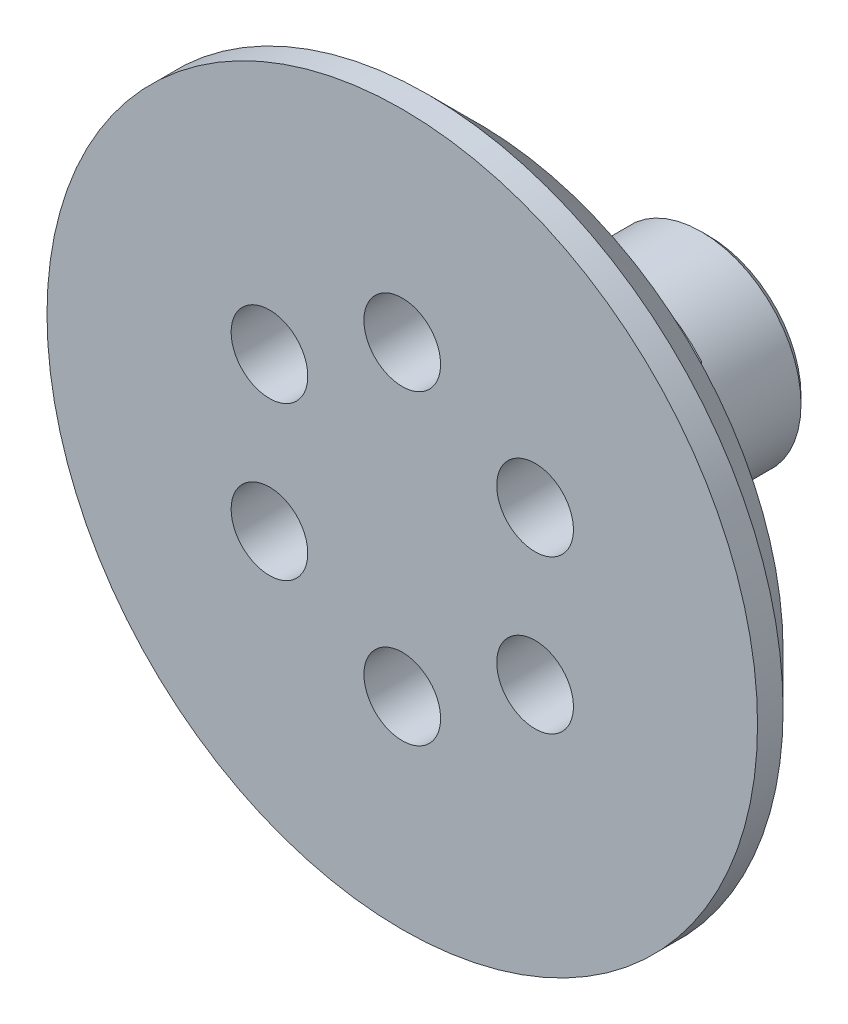
ISO-10303-21;
HEADER;
FILE_DESCRIPTION(('STEP AP214'),'2;1');
FILE_NAME('part.step','',(''),(''),'','','');
FILE_SCHEMA(('AUTOMOTIVE_DESIGN { 1 0 10303 214 1 1 1 1 }'));
ENDSEC;
DATA;
#1=APPLICATION_CONTEXT('core data for automotive mechanical design processes');
#2=APPLICATION_PROTOCOL_DEFINITION('international standard','automotive_design',2000,#1);
#3=PRODUCT_CONTEXT('',#1,'mechanical');
#4=PRODUCT('Part','Part','',(#3));
#5=PRODUCT_RELATED_PRODUCT_CATEGORY('part','',(#4));
#6=PRODUCT_DEFINITION_FORMATION('','',#4);
#7=PRODUCT_DEFINITION_CONTEXT('part definition',#1,'design');
#8=PRODUCT_DEFINITION('design','',#6,#7);
#9=PRODUCT_DEFINITION_SHAPE('','',#8);
#10=(LENGTH_UNIT() NAMED_UNIT(*) SI_UNIT(.MILLI.,.METRE.));
#11=(NAMED_UNIT(*) PLANE_ANGLE_UNIT() SI_UNIT($,.RADIAN.));
#12=(NAMED_UNIT(*) SI_UNIT($,.STERADIAN.) SOLID_ANGLE_UNIT());
#13=UNCERTAINTY_MEASURE_WITH_UNIT(LENGTH_MEASURE(1.E-05),#10,'distance_accuracy_value','');
#14=(GEOMETRIC_REPRESENTATION_CONTEXT(3) GLOBAL_UNCERTAINTY_ASSIGNED_CONTEXT((#13)) GLOBAL_UNIT_ASSIGNED_CONTEXT((#10,
#11,#12)) REPRESENTATION_CONTEXT('',''));
#15=CARTESIAN_POINT('',(0.,0.,0.));
#16=DIRECTION('',(0.,0.,1.));
#17=DIRECTION('',(1.,0.,0.));
#18=AXIS2_PLACEMENT_3D('',#15,#16,#17);
#19=CARTESIAN_POINT('',(0.,0.,4.));
#20=DIRECTION('',(0.,0.,1.));
#21=DIRECTION('',(1.,0.,0.));
#22=AXIS2_PLACEMENT_3D('',#19,#20,#21);
#23=CYLINDRICAL_SURFACE('',#22,4.9);
#24=CARTESIAN_POINT('',(0.,0.,9.));
#25=DIRECTION('',(0.,0.,1.));
#26=DIRECTION('',(1.,0.,0.));
#27=AXIS2_PLACEMENT_3D('',#24,#25,#26);
#28=CIRCLE('',#27,4.9);
#29=CARTESIAN_POINT('',(-4.62722329563246,-1.61208082066511,9.));
#30=VERTEX_POINT('',#29);
#31=CARTESIAN_POINT('',(-4.62722329563267,1.61208082066449,9.));
#32=VERTEX_POINT('',#31);
#33=EDGE_CURVE('E185',#30,#32,#28,.F.);
#34=ORIENTED_EDGE('',*,*,#33,.T.);
#35=DIRECTION('',(0.,0.,-1.));
#36=VECTOR('',#35,1.);
#37=CARTESIAN_POINT('',(-4.62722329563267,1.61208082066449,6.));
#38=LINE('',#37,#36);
#39=CARTESIAN_POINT('',(-4.62722329563267,1.61208082066449,4.));
#40=VERTEX_POINT('',#39);
#41=EDGE_CURVE('E355',#32,#40,#38,.T.);
#42=ORIENTED_EDGE('',*,*,#41,.T.);
#43=CARTESIAN_POINT('',(0.,0.,4.));
#44=DIRECTION('',(0.,0.,-1.));
#45=DIRECTION('',(-1.,0.,0.));
#46=AXIS2_PLACEMENT_3D('',#43,#44,#45);
#47=CIRCLE('',#46,4.9);
#48=CARTESIAN_POINT('',(-4.62722329563246,-1.61208082066511,4.));
#49=VERTEX_POINT('',#48);
#50=EDGE_CURVE('E360',#49,#40,#47,.T.);
#51=ORIENTED_EDGE('',*,*,#50,.F.);
#52=DIRECTION('',(0.,0.,-1.));
#53=VECTOR('',#52,1.);
#54=CARTESIAN_POINT('',(-4.62722329563246,-1.61208082066511,6.));
#55=LINE('',#54,#53);
#56=EDGE_CURVE('E344',#49,#30,#55,.F.);
#57=ORIENTED_EDGE('',*,*,#56,.T.);
#58=EDGE_LOOP('',(#34,#42,#51,#57));
#59=FACE_BOUND('',#58,.T.);
#60=ADVANCED_FACE('F39',(#59),#23,.T.);
#61=CARTESIAN_POINT('',(-0.917508704166362,-4.81333333333346,9.));
#62=VERTEX_POINT('',#61);
#63=CARTESIAN_POINT('',(-3.70971459146531,-3.20125251266897,9.));
#64=VERTEX_POINT('',#63);
#65=EDGE_CURVE('E616',#62,#64,#28,.F.);
#66=ORIENTED_EDGE('',*,*,#65,.T.);
#67=DIRECTION('',(0.,0.,-1.));
#68=VECTOR('',#67,1.);
#69=CARTESIAN_POINT('',(-3.70971459146531,-3.20125251266897,6.));
#70=LINE('',#69,#68);
#71=CARTESIAN_POINT('',(-3.70971459146531,-3.20125251266897,4.));
#72=VERTEX_POINT('',#71);
#73=EDGE_CURVE('E347',#64,#72,#70,.T.);
#74=ORIENTED_EDGE('',*,*,#73,.T.);
#75=CARTESIAN_POINT('',(-0.917508704166366,-4.81333333333346,4.));
#76=VERTEX_POINT('',#75);
#77=EDGE_CURVE('E363',#76,#72,#47,.T.);
#78=ORIENTED_EDGE('',*,*,#77,.F.);
#79=DIRECTION('',(0.,0.,-1.));
#80=VECTOR('',#79,1.);
#81=CARTESIAN_POINT('',(-0.917508704166363,-4.81333333333346,6.));
#82=LINE('',#81,#80);
#83=EDGE_CURVE('E337',#76,#62,#82,.F.);
#84=ORIENTED_EDGE('',*,*,#83,.T.);
#85=EDGE_LOOP('',(#66,#74,#78,#84));
#86=FACE_BOUND('',#85,.T.);
#87=ADVANCED_FACE('F277',(#86),#23,.T.);
#88=CARTESIAN_POINT('',(3.70971459146617,-3.20125251266797,9.));
#89=VERTEX_POINT('',#88);
#90=CARTESIAN_POINT('',(0.917508704167652,-4.81333333333321,9.));
#91=VERTEX_POINT('',#90);
#92=EDGE_CURVE('E188',#89,#91,#28,.F.);
#93=ORIENTED_EDGE('',*,*,#92,.T.);
#94=DIRECTION('',(0.,0.,-1.));
#95=VECTOR('',#94,1.);
#96=CARTESIAN_POINT('',(0.917508704167653,-4.81333333333321,6.));
#97=LINE('',#96,#95);
#98=CARTESIAN_POINT('',(0.917508704167651,-4.81333333333321,4.));
#99=VERTEX_POINT('',#98);
#100=EDGE_CURVE('E340',#91,#99,#97,.T.);
#101=ORIENTED_EDGE('',*,*,#100,.T.);
#102=CARTESIAN_POINT('',(3.70971459146616,-3.20125251266798,4.));
#103=VERTEX_POINT('',#102);
#104=EDGE_CURVE('E327',#103,#99,#47,.T.);
#105=ORIENTED_EDGE('',*,*,#104,.F.);
#106=DIRECTION('',(0.,0.,-1.));
#107=VECTOR('',#106,1.);
#108=CARTESIAN_POINT('',(3.70971459146617,-3.20125251266797,6.));
#109=LINE('',#108,#107);
#110=EDGE_CURVE('E322',#103,#89,#109,.F.);
#111=ORIENTED_EDGE('',*,*,#110,.T.);
#112=EDGE_LOOP('',(#93,#101,#105,#111));
#113=FACE_BOUND('',#112,.T.);
#114=ADVANCED_FACE('F283',(#113),#23,.T.);
#115=CARTESIAN_POINT('',(4.62722329563224,1.61208082066573,9.));
#116=VERTEX_POINT('',#115);
#117=CARTESIAN_POINT('',(4.62722329563289,-1.61208082066387,9.));
#118=VERTEX_POINT('',#117);
#119=EDGE_CURVE('E183',#116,#118,#28,.F.);
#120=ORIENTED_EDGE('',*,*,#119,.T.);
#121=DIRECTION('',(0.,0.,-1.));
#122=VECTOR('',#121,1.);
#123=CARTESIAN_POINT('',(4.62722329563289,-1.61208082066387,6.));
#124=LINE('',#123,#122);
#125=CARTESIAN_POINT('',(4.62722329563289,-1.61208082066387,4.));
#126=VERTEX_POINT('',#125);
#127=EDGE_CURVE('E313',#118,#126,#124,.T.);
#128=ORIENTED_EDGE('',*,*,#127,.T.);
#129=CARTESIAN_POINT('',(4.62722329563224,1.61208082066573,4.));
#130=VERTEX_POINT('',#129);
#131=EDGE_CURVE('E608',#130,#126,#47,.T.);
#132=ORIENTED_EDGE('',*,*,#131,.F.);
#133=DIRECTION('',(0.,0.,-1.));
#134=VECTOR('',#133,1.);
#135=CARTESIAN_POINT('',(4.62722329563224,1.61208082066573,6.));
#136=LINE('',#135,#134);
#137=EDGE_CURVE('E315',#130,#116,#136,.F.);
#138=ORIENTED_EDGE('',*,*,#137,.T.);
#139=EDGE_LOOP('',(#120,#128,#132,#138));
#140=FACE_BOUND('',#139,.T.);
#141=ADVANCED_FACE('F298',(#140),#23,.T.);
#142=CARTESIAN_POINT('',(0.917508704167007,4.81333333333333,9.));
#143=VERTEX_POINT('',#142);
#144=CARTESIAN_POINT('',(3.70971459146488,3.20125251266947,9.));
#145=VERTEX_POINT('',#144);
#146=EDGE_CURVE('E174',#143,#145,#28,.F.);
#147=ORIENTED_EDGE('',*,*,#146,.T.);
#148=DIRECTION('',(0.,0.,-1.));
#149=VECTOR('',#148,1.);
#150=CARTESIAN_POINT('',(3.70971459146488,3.20125251266947,6.));
#151=LINE('',#150,#149);
#152=CARTESIAN_POINT('',(3.70971459146488,3.20125251266947,4.));
#153=VERTEX_POINT('',#152);
#154=EDGE_CURVE('E332',#145,#153,#151,.T.);
#155=ORIENTED_EDGE('',*,*,#154,.T.);
#156=CARTESIAN_POINT('',(0.917508704167007,4.81333333333333,4.));
#157=VERTEX_POINT('',#156);
#158=EDGE_CURVE('E176',#157,#153,#47,.T.);
#159=ORIENTED_EDGE('',*,*,#158,.F.);
#160=DIRECTION('',(0.,0.,-1.));
#161=VECTOR('',#160,1.);
#162=CARTESIAN_POINT('',(0.917508704167008,4.81333333333333,6.));
#163=LINE('',#162,#161);
#164=EDGE_CURVE('E158',#157,#143,#163,.F.);
#165=ORIENTED_EDGE('',*,*,#164,.T.);
#166=EDGE_LOOP('',(#147,#155,#159,#165));
#167=FACE_BOUND('',#166,.T.);
#168=ADVANCED_FACE('F172',(#167),#23,.T.);
#169=CARTESIAN_POINT('',(0.,0.,11.));
#170=DIRECTION('',(0.,0.,-1.));
#171=DIRECTION('',(-1.,0.,0.));
#172=AXIS2_PLACEMENT_3D('',#169,#170,#171);
#173=CYLINDRICAL_SURFACE('',#172,3.9);
#174=CARTESIAN_POINT('',(0.,0.,4.));
#175=DIRECTION('',(0.,0.,-1.));
#176=DIRECTION('',(-1.,0.,0.));
#177=AXIS2_PLACEMENT_3D('',#174,#175,#176);
#178=CIRCLE('',#177,3.9);
#179=CARTESIAN_POINT('',(-3.9,0.,4.));
#180=VERTEX_POINT('',#179);
#181=EDGE_CURVE('E192',#180,#180,#178,.T.);
#182=ORIENTED_EDGE('',*,*,#181,.T.);
#183=EDGE_LOOP('',(#182));
#184=FACE_BOUND('',#183,.T.);
#185=CARTESIAN_POINT('',(0.,0.,0.300000000000003));
#186=DIRECTION('',(0.,0.,1.));
#187=DIRECTION('',(1.,0.,0.));
#188=AXIS2_PLACEMENT_3D('',#185,#186,#187);
#189=CIRCLE('',#188,3.9);
#190=CARTESIAN_POINT('',(3.9,0.,0.300000000000003));
#191=VERTEX_POINT('',#190);
#192=EDGE_CURVE('E249',#191,#191,#189,.T.);
#193=ORIENTED_EDGE('',*,*,#192,.T.);
#194=EDGE_LOOP('',(#193));
#195=FACE_BOUND('',#194,.T.);
#196=ADVANCED_FACE('F297',(#184,#195),#173,.T.);
#197=CARTESIAN_POINT('',(0.,0.,11.));
#198=DIRECTION('',(0.,0.,-1.));
#199=DIRECTION('',(-1.,0.,0.));
#200=AXIS2_PLACEMENT_3D('',#197,#198,#199);
#201=CYLINDRICAL_SURFACE('',#200,2.65);
#202=CARTESIAN_POINT('',(0.,0.,0.300000000000005));
#203=DIRECTION('',(0.,0.,1.));
#204=DIRECTION('',(1.,0.,0.));
#205=AXIS2_PLACEMENT_3D('',#202,#203,#204);
#206=CIRCLE('',#205,2.65);
#207=CARTESIAN_POINT('',(-2.65,0.,0.300000000000005));
#208=VERTEX_POINT('',#207);
#209=EDGE_CURVE('E247',#208,#208,#206,.F.);
#210=ORIENTED_EDGE('',*,*,#209,.T.);
#211=EDGE_LOOP('',(#210));
#212=FACE_BOUND('',#211,.T.);
#213=CARTESIAN_POINT('',(0.,0.,8.));
#214=DIRECTION('',(0.,0.,1.));
#215=DIRECTION('',(1.,0.,0.));
#216=AXIS2_PLACEMENT_3D('',#213,#214,#215);
#217=CIRCLE('',#216,2.65);
#218=CARTESIAN_POINT('',(1.65,2.07364413533277,8.));
#219=VERTEX_POINT('',#218);
#220=CARTESIAN_POINT('',(-1.65,2.07364413533277,8.));
#221=VERTEX_POINT('',#220);
#222=EDGE_CURVE('E242',#219,#221,#217,.T.);
#223=ORIENTED_EDGE('',*,*,#222,.T.);
#224=DIRECTION('',(0.,0.,1.));
#225=VECTOR('',#224,1.);
#226=CARTESIAN_POINT('',(-1.65,2.07364413533277,1.8));
#227=LINE('',#226,#225);
#228=CARTESIAN_POINT('',(-1.65,2.07364413533277,2.80000000000001));
#229=VERTEX_POINT('',#228);
#230=EDGE_CURVE('E238',#229,#221,#227,.T.);
#231=ORIENTED_EDGE('',*,*,#230,.F.);
#232=CARTESIAN_POINT('',(0.,0.,4.45000000000001));
#233=DIRECTION('',(0.707106781186549,0.,-0.707106781186546));
#234=DIRECTION('',(-0.707106781186546,0.,-0.707106781186549));
#235=AXIS2_PLACEMENT_3D('',#232,#233,#234);
#236=ELLIPSE('',#235,3.74766594028871,2.65);
#237=CARTESIAN_POINT('',(-2.65,0.,1.8));
#238=VERTEX_POINT('',#237);
#239=EDGE_CURVE('E220',#229,#238,#236,.F.);
#240=ORIENTED_EDGE('',*,*,#239,.T.);
#241=CARTESIAN_POINT('',(0.,0.,4.45000000000001));
#242=DIRECTION('',(0.707106781186549,0.,-0.707106781186546));
#243=DIRECTION('',(-0.707106781186546,0.,-0.707106781186549));
#244=AXIS2_PLACEMENT_3D('',#241,#242,#243);
#245=ELLIPSE('',#244,3.74766594028871,2.65);
#246=CARTESIAN_POINT('',(-1.65,-2.07364413533277,2.80000000000001));
#247=VERTEX_POINT('',#246);
#248=EDGE_CURVE('E218',#238,#247,#245,.F.);
#249=ORIENTED_EDGE('',*,*,#248,.T.);
#250=DIRECTION('',(0.,0.,1.));
#251=VECTOR('',#250,1.);
#252=CARTESIAN_POINT('',(-1.65,-2.07364413533277,1.8));
#253=LINE('',#252,#251);
#254=CARTESIAN_POINT('',(-1.65,-2.07364413533277,8.));
#255=VERTEX_POINT('',#254);
#256=EDGE_CURVE('E369',#247,#255,#253,.T.);
#257=ORIENTED_EDGE('',*,*,#256,.T.);
#258=CARTESIAN_POINT('',(1.65,-2.07364413533277,8.));
#259=VERTEX_POINT('',#258);
#260=EDGE_CURVE('E233',#255,#259,#217,.T.);
#261=ORIENTED_EDGE('',*,*,#260,.T.);
#262=DIRECTION('',(0.,0.,1.));
#263=VECTOR('',#262,1.);
#264=CARTESIAN_POINT('',(1.65,-2.07364413533277,1.8));
#265=LINE('',#264,#263);
#266=CARTESIAN_POINT('',(1.65,-2.07364413533277,2.8));
#267=VERTEX_POINT('',#266);
#268=EDGE_CURVE('E227',#267,#259,#265,.T.);
#269=ORIENTED_EDGE('',*,*,#268,.F.);
#270=CARTESIAN_POINT('',(0.,0.,4.44999999999999));
#271=DIRECTION('',(0.707106781186546,0.,0.707106781186549));
#272=DIRECTION('',(0.707106781186549,0.,-0.707106781186546));
#273=AXIS2_PLACEMENT_3D('',#270,#271,#272);
#274=ELLIPSE('',#273,3.7476659402887,2.65);
#275=CARTESIAN_POINT('',(2.65,0.,1.8));
#276=VERTEX_POINT('',#275);
#277=EDGE_CURVE('E47',#267,#276,#274,.T.);
#278=ORIENTED_EDGE('',*,*,#277,.T.);
#279=CARTESIAN_POINT('',(0.,0.,4.44999999999999));
#280=DIRECTION('',(0.707106781186546,0.,0.707106781186549));
#281=DIRECTION('',(0.707106781186549,0.,-0.707106781186546));
#282=AXIS2_PLACEMENT_3D('',#279,#280,#281);
#283=ELLIPSE('',#282,3.7476659402887,2.65);
#284=CARTESIAN_POINT('',(1.65,2.07364413533277,2.8));
#285=VERTEX_POINT('',#284);
#286=EDGE_CURVE('E11',#276,#285,#283,.T.);
#287=ORIENTED_EDGE('',*,*,#286,.T.);
#288=DIRECTION('',(0.,0.,1.));
#289=VECTOR('',#288,1.);
#290=CARTESIAN_POINT('',(1.65,2.07364413533277,1.8));
#291=LINE('',#290,#289);
#292=EDGE_CURVE('E229',#285,#219,#291,.T.);
#293=ORIENTED_EDGE('',*,*,#292,.T.);
#294=EDGE_LOOP('',(#223,#231,#240,#249,#257,#261,#269,#278,#287,#293));
#295=FACE_BOUND('',#294,.T.);
#296=ADVANCED_FACE('F231',(#212,#295),#201,.F.);
#297=CARTESIAN_POINT('',(0.,0.,8.));
#298=DIRECTION('',(0.,0.,1.));
#299=DIRECTION('',(1.,0.,0.));
#300=AXIS2_PLACEMENT_3D('',#297,#298,#299);
#301=PLANE('',#300);
#302=DIRECTION('',(0.,-1.,0.));
#303=VECTOR('',#302,1.);
#304=CARTESIAN_POINT('',(-1.65,0.,8.));
#305=LINE('',#304,#303);
#306=EDGE_CURVE('E366',#221,#255,#305,.T.);
#307=ORIENTED_EDGE('',*,*,#306,.F.);
#308=ORIENTED_EDGE('',*,*,#222,.F.);
#309=DIRECTION('',(0.,-1.,0.));
#310=VECTOR('',#309,1.);
#311=CARTESIAN_POINT('',(1.65,0.,8.));
#312=LINE('',#311,#310);
#313=EDGE_CURVE('E235',#219,#259,#312,.T.);
#314=ORIENTED_EDGE('',*,*,#313,.T.);
#315=ORIENTED_EDGE('',*,*,#260,.F.);
#316=EDGE_LOOP('',(#307,#308,#314,#315));
#317=FACE_BOUND('',#316,.T.);
#318=ADVANCED_FACE('F377',(#317),#301,.F.);
#319=CARTESIAN_POINT('',(0.,0.,0.));
#320=DIRECTION('',(0.,0.,1.));
#321=DIRECTION('',(1.,0.,0.));
#322=AXIS2_PLACEMENT_3D('',#319,#320,#321);
#323=PLANE('',#322);
#324=CARTESIAN_POINT('',(0.,0.,0.));
#325=DIRECTION('',(0.,0.,1.));
#326=DIRECTION('',(1.,0.,0.));
#327=AXIS2_PLACEMENT_3D('',#324,#325,#326);
#328=CIRCLE('',#327,3.6);
#329=CARTESIAN_POINT('',(3.6,0.,0.));
#330=VERTEX_POINT('',#329);
#331=EDGE_CURVE('E187',#330,#330,#328,.F.);
#332=ORIENTED_EDGE('',*,*,#331,.T.);
#333=EDGE_LOOP('',(#332));
#334=FACE_BOUND('',#333,.T.);
#335=CARTESIAN_POINT('',(0.,0.,0.));
#336=DIRECTION('',(0.,0.,1.));
#337=DIRECTION('',(1.,0.,0.));
#338=AXIS2_PLACEMENT_3D('',#335,#336,#337);
#339=CIRCLE('',#338,2.95);
#340=CARTESIAN_POINT('',(-2.95,0.,0.));
#341=VERTEX_POINT('',#340);
#342=EDGE_CURVE('E244',#341,#341,#339,.T.);
#343=ORIENTED_EDGE('',*,*,#342,.T.);
#344=EDGE_LOOP('',(#343));
#345=FACE_BOUND('',#344,.T.);
#346=ADVANCED_FACE('F256',(#334,#345),#323,.F.);
#347=CARTESIAN_POINT('',(1.65,0.,1.8));
#348=DIRECTION('',(-1.,0.,0.));
#349=DIRECTION('',(0.,0.,1.));
#350=AXIS2_PLACEMENT_3D('',#347,#348,#349);
#351=PLANE('',#350);
#352=ORIENTED_EDGE('',*,*,#292,.F.);
#353=DIRECTION('',(0.,-1.,0.));
#354=VECTOR('',#353,1.);
#355=CARTESIAN_POINT('',(1.65,0.,2.8));
#356=LINE('',#355,#354);
#357=EDGE_CURVE('E222',#285,#267,#356,.T.);
#358=ORIENTED_EDGE('',*,*,#357,.T.);
#359=ORIENTED_EDGE('',*,*,#268,.T.);
#360=ORIENTED_EDGE('',*,*,#313,.F.);
#361=EDGE_LOOP('',(#352,#358,#359,#360));
#362=FACE_BOUND('',#361,.T.);
#363=ADVANCED_FACE('F225',(#362),#351,.T.);
#364=CARTESIAN_POINT('',(-1.65,0.,1.8));
#365=DIRECTION('',(-1.,0.,0.));
#366=DIRECTION('',(0.,0.,1.));
#367=AXIS2_PLACEMENT_3D('',#364,#365,#366);
#368=PLANE('',#367);
#369=ORIENTED_EDGE('',*,*,#256,.F.);
#370=DIRECTION('',(0.,1.,0.));
#371=VECTOR('',#370,1.);
#372=CARTESIAN_POINT('',(-1.65,2.07364413533277,2.80000000000001));
#373=LINE('',#372,#371);
#374=EDGE_CURVE('E215',#247,#229,#373,.T.);
#375=ORIENTED_EDGE('',*,*,#374,.T.);
#376=ORIENTED_EDGE('',*,*,#230,.T.);
#377=ORIENTED_EDGE('',*,*,#306,.T.);
#378=EDGE_LOOP('',(#369,#375,#376,#377));
#379=FACE_BOUND('',#378,.T.);
#380=ADVANCED_FACE('F272',(#379),#368,.F.);
#381=CARTESIAN_POINT('',(0.,0.,0.));
#382=DIRECTION('',(0.,0.,-1.));
#383=DIRECTION('',(-1.,0.,0.));
#384=AXIS2_PLACEMENT_3D('',#381,#382,#383);
#385=CONICAL_SURFACE('',#384,2.95,0.785398163397442);
#386=CARTESIAN_POINT('',(-2.65,0.,0.300000000000005));
#387=CARTESIAN_POINT('',(-2.653125,0.,0.296875000000005));
#388=CARTESIAN_POINT('',(-2.65625,0.,0.293750000000005));
#389=CARTESIAN_POINT('',(-2.6625,0.,0.287500000000005));
#390=CARTESIAN_POINT('',(-2.665625,0.,0.284375000000005));
#391=CARTESIAN_POINT('',(-2.671875,0.,0.278125000000005));
#392=CARTESIAN_POINT('',(-2.675,0.,0.275000000000005));
#393=CARTESIAN_POINT('',(-2.68125,0.,0.268750000000004));
#394=CARTESIAN_POINT('',(-2.684375,0.,0.265625000000004));
#395=CARTESIAN_POINT('',(-2.690625,0.,0.259375000000004));
#396=CARTESIAN_POINT('',(-2.69375,0.,0.256250000000004));
#397=CARTESIAN_POINT('',(-2.7,0.,0.250000000000004));
#398=CARTESIAN_POINT('',(-2.703125,0.,0.246875000000004));
#399=CARTESIAN_POINT('',(-2.709375,0.,0.240625000000004));
#400=CARTESIAN_POINT('',(-2.7125,0.,0.237500000000004));
#401=CARTESIAN_POINT('',(-2.71875,0.,0.231250000000004));
#402=CARTESIAN_POINT('',(-2.721875,0.,0.228125000000004));
#403=CARTESIAN_POINT('',(-2.728125,0.,0.221875000000004));
#404=CARTESIAN_POINT('',(-2.73125,0.,0.218750000000004));
#405=CARTESIAN_POINT('',(-2.7375,0.,0.212500000000004));
#406=CARTESIAN_POINT('',(-2.740625,0.,0.209375000000004));
#407=CARTESIAN_POINT('',(-2.746875,0.,0.203125000000003));
#408=CARTESIAN_POINT('',(-2.75,0.,0.200000000000003));
#409=CARTESIAN_POINT('',(-2.75625,0.,0.193750000000003));
#410=CARTESIAN_POINT('',(-2.759375,0.,0.190625000000003));
#411=CARTESIAN_POINT('',(-2.765625,0.,0.184375000000003));
#412=CARTESIAN_POINT('',(-2.76875,0.,0.181250000000003));
#413=CARTESIAN_POINT('',(-2.775,0.,0.175000000000003));
#414=CARTESIAN_POINT('',(-2.778125,0.,0.171875000000003));
#415=CARTESIAN_POINT('',(-2.784375,0.,0.165625000000003));
#416=CARTESIAN_POINT('',(-2.7875,0.,0.162500000000003));
#417=CARTESIAN_POINT('',(-2.79375,0.,0.156250000000003));
#418=CARTESIAN_POINT('',(-2.796875,0.,0.153125000000003));
#419=CARTESIAN_POINT('',(-2.803125,0.,0.146875000000002));
#420=CARTESIAN_POINT('',(-2.80625,0.,0.143750000000002));
#421=CARTESIAN_POINT('',(-2.8125,0.,0.137500000000002));
#422=CARTESIAN_POINT('',(-2.815625,0.,0.134375000000002));
#423=CARTESIAN_POINT('',(-2.821875,0.,0.128125000000002));
#424=CARTESIAN_POINT('',(-2.825,0.,0.125000000000002));
#425=CARTESIAN_POINT('',(-2.83125,0.,0.118750000000002));
#426=CARTESIAN_POINT('',(-2.834375,0.,0.115625000000002));
#427=CARTESIAN_POINT('',(-2.840625,0.,0.109375000000002));
#428=CARTESIAN_POINT('',(-2.84375,0.,0.106250000000002));
#429=CARTESIAN_POINT('',(-2.85,0.,0.100000000000002));
#430=CARTESIAN_POINT('',(-2.853125,0.,0.0968750000000016));
#431=CARTESIAN_POINT('',(-2.859375,0.,0.0906250000000015));
#432=CARTESIAN_POINT('',(-2.8625,0.,0.0875000000000015));
#433=CARTESIAN_POINT('',(-2.86875,0.,0.0812500000000014));
#434=CARTESIAN_POINT('',(-2.871875,0.,0.0781250000000013));
#435=CARTESIAN_POINT('',(-2.878125,0.,0.0718750000000012));
#436=CARTESIAN_POINT('',(-2.88125,0.,0.0687500000000012));
#437=CARTESIAN_POINT('',(-2.8875,0.,0.0625000000000011));
#438=CARTESIAN_POINT('',(-2.890625,0.,0.059375000000001));
#439=CARTESIAN_POINT('',(-2.896875,0.,0.0531250000000009));
#440=CARTESIAN_POINT('',(-2.9,0.,0.0500000000000009));
#441=CARTESIAN_POINT('',(-2.90625,0.,0.0437500000000008));
#442=CARTESIAN_POINT('',(-2.909375,0.,0.0406250000000006));
#443=CARTESIAN_POINT('',(-2.915625,0.,0.0343750000000005));
#444=CARTESIAN_POINT('',(-2.91875,0.,0.0312500000000006));
#445=CARTESIAN_POINT('',(-2.925,0.,0.0250000000000005));
#446=CARTESIAN_POINT('',(-2.928125,0.,0.0218750000000003));
#447=CARTESIAN_POINT('',(-2.934375,0.,0.0156250000000002));
#448=CARTESIAN_POINT('',(-2.9375,0.,0.0125000000000002));
#449=CARTESIAN_POINT('',(-2.94375,0.,0.00625000000000019));
#450=CARTESIAN_POINT('',(-2.946875,0.,0.00312500000000018));
#451=CARTESIAN_POINT('',(-2.95,0.,0.));
#452=B_SPLINE_CURVE_WITH_KNOTS('',3,(#386,#387,#388,#389,#390,#391,#392,#393,#394,#395,#396,
#397,#398,#399,#400,#401,#402,#403,#404,#405,#406,#407,#408,#409,#410,#411,#412,#413,#414,#415,
#416,#417,#418,#419,#420,#421,#422,#423,#424,#425,#426,#427,#428,#429,#430,#431,#432,#433,#434,
#435,#436,#437,#438,#439,#440,#441,#442,#443,#444,#445,#446,#447,#448,#449,#450,#451),
.UNSPECIFIED.,.F.,.F.,(4,2,2,2,2,2,2,2,2,2,2,2,2,2,2,2,2,2,2,2,2,2,2,2,2,2,2,2,2,2,2,2,4),(0.,
0.0132582521472481,0.0265165042944958,0.0397747564417436,0.0530330085889917,0.0662912607362394,
0.0795495128834875,0.0928077650307352,0.106066017177983,0.119324269325231,0.132582521472479,
0.145840773619727,0.159099025766975,0.172357277914223,0.185615530061471,0.198873782208719,
0.212132034355966,0.225390286503214,0.238648538650462,0.25190679079771,0.265165042944958,
0.278423295092206,0.291681547239454,0.304939799386702,0.31819805153395,0.331456303681198,
0.344714555828446,0.357972807975694,0.371231060122941,0.384489312270189,0.397747564417437,
0.411005816564685,0.424264068711933),.UNSPECIFIED.);
#453=EDGE_CURVE('BSEAM263',#208,#341,#452,.T.);
#454=ORIENTED_EDGE('',*,*,#209,.F.);
#455=ORIENTED_EDGE('',*,*,#342,.F.);
#456=ORIENTED_EDGE('',*,*,#453,.T.);
#457=ORIENTED_EDGE('',*,*,#453,.F.);
#458=EDGE_LOOP('',(#454,#456,#455,#457));
#459=FACE_BOUND('',#458,.T.);
#460=ADVANCED_FACE('F263',(#459),#385,.F.);
#461=CARTESIAN_POINT('',(0.,0.,0.300000000000003));
#462=DIRECTION('',(0.,0.,1.));
#463=DIRECTION('',(1.,0.,0.));
#464=AXIS2_PLACEMENT_3D('',#461,#462,#463);
#465=CONICAL_SURFACE('',#464,3.9,0.78539816339745);
#466=ORIENTED_EDGE('',*,*,#331,.F.);
#467=EDGE_LOOP('',(#466));
#468=FACE_BOUND('',#467,.T.);
#469=ORIENTED_EDGE('',*,*,#192,.F.);
#470=EDGE_LOOP('',(#469));
#471=FACE_BOUND('',#470,.T.);
#472=ADVANCED_FACE('F259',(#468,#471),#465,.T.);
#473=CARTESIAN_POINT('',(0.,0.,4.));
#474=DIRECTION('',(0.,0.,-1.));
#475=DIRECTION('',(-1.,0.,0.));
#476=AXIS2_PLACEMENT_3D('',#473,#474,#475);
#477=PLANE('',#476);
#478=CARTESIAN_POINT('',(-5.19615242270677,2.99999999999977,4.));
#479=DIRECTION('',(0.,0.,-1.));
#480=DIRECTION('',(-1.,0.,0.));
#481=AXIS2_PLACEMENT_3D('',#478,#479,#480);
#482=CIRCLE('',#481,1.5);
#483=CARTESIAN_POINT('',(-3.70971459146574,3.20125251266847,4.));
#484=VERTEX_POINT('',#483);
#485=EDGE_CURVE('E358',#484,#40,#482,.T.);
#486=ORIENTED_EDGE('',*,*,#485,.F.);
#487=CARTESIAN_POINT('',(-0.917508704167008,4.81333333333333,4.));
#488=VERTEX_POINT('',#487);
#489=EDGE_CURVE('E196',#484,#488,#47,.T.);
#490=ORIENTED_EDGE('',*,*,#489,.T.);
#491=CARTESIAN_POINT('',(0.,6.,4.));
#492=DIRECTION('',(0.,0.,-1.));
#493=DIRECTION('',(-1.,0.,0.));
#494=AXIS2_PLACEMENT_3D('',#491,#492,#493);
#495=CIRCLE('',#494,1.5);
#496=EDGE_CURVE('E603',#157,#488,#495,.T.);
#497=ORIENTED_EDGE('',*,*,#496,.F.);
#498=ORIENTED_EDGE('',*,*,#158,.T.);
#499=CARTESIAN_POINT('',(5.19615242270596,3.00000000000116,4.));
#500=DIRECTION('',(0.,0.,-1.));
#501=DIRECTION('',(-1.,0.,0.));
#502=AXIS2_PLACEMENT_3D('',#499,#500,#501);
#503=CIRCLE('',#502,1.5);
#504=EDGE_CURVE('E328',#130,#153,#503,.T.);
#505=ORIENTED_EDGE('',*,*,#504,.F.);
#506=ORIENTED_EDGE('',*,*,#131,.T.);
#507=CARTESIAN_POINT('',(5.19615242270717,-2.99999999999907,4.));
#508=DIRECTION('',(0.,0.,-1.));
#509=DIRECTION('',(-1.,0.,0.));
#510=AXIS2_PLACEMENT_3D('',#507,#508,#509);
#511=CIRCLE('',#510,1.5);
#512=EDGE_CURVE('E330',#103,#126,#511,.T.);
#513=ORIENTED_EDGE('',*,*,#512,.F.);
#514=ORIENTED_EDGE('',*,*,#104,.T.);
#515=CARTESIAN_POINT('',(8.03954860168825E-13,-6.,4.));
#516=DIRECTION('',(0.,0.,-1.));
#517=DIRECTION('',(-1.,0.,0.));
#518=AXIS2_PLACEMENT_3D('',#515,#516,#517);
#519=CIRCLE('',#518,1.5);
#520=EDGE_CURVE('E342',#76,#99,#519,.T.);
#521=ORIENTED_EDGE('',*,*,#520,.F.);
#522=ORIENTED_EDGE('',*,*,#77,.T.);
#523=CARTESIAN_POINT('',(-5.19615242270636,-3.00000000000046,4.));
#524=DIRECTION('',(0.,0.,-1.));
#525=DIRECTION('',(-1.,0.,0.));
#526=AXIS2_PLACEMENT_3D('',#523,#524,#525);
#527=CIRCLE('',#526,1.5);
#528=EDGE_CURVE('E350',#49,#72,#527,.T.);
#529=ORIENTED_EDGE('',*,*,#528,.F.);
#530=ORIENTED_EDGE('',*,*,#50,.T.);
#531=EDGE_LOOP('',(#486,#490,#497,#498,#505,#506,#513,#514,#521,#522,#529,#530));
#532=FACE_BOUND('',#531,.T.);
#533=ORIENTED_EDGE('',*,*,#181,.F.);
#534=EDGE_LOOP('',(#533));
#535=FACE_BOUND('',#534,.T.);
#536=ADVANCED_FACE('F262',(#532,#535),#477,.T.);
#537=ORIENTED_EDGE('',*,*,#489,.F.);
#538=DIRECTION('',(0.,0.,-1.));
#539=VECTOR('',#538,1.);
#540=CARTESIAN_POINT('',(-3.70971459146574,3.20125251266847,6.));
#541=LINE('',#540,#539);
#542=CARTESIAN_POINT('',(-3.70971459146574,3.20125251266847,9.));
#543=VERTEX_POINT('',#542);
#544=EDGE_CURVE('E352',#484,#543,#541,.F.);
#545=ORIENTED_EDGE('',*,*,#544,.T.);
#546=CARTESIAN_POINT('',(-0.917508704167007,4.81333333333333,9.));
#547=VERTEX_POINT('',#546);
#548=EDGE_CURVE('E182',#543,#547,#28,.F.);
#549=ORIENTED_EDGE('',*,*,#548,.T.);
#550=DIRECTION('',(0.,0.,-1.));
#551=VECTOR('',#550,1.);
#552=CARTESIAN_POINT('',(-0.917508704167008,4.81333333333333,6.));
#553=LINE('',#552,#551);
#554=EDGE_CURVE('E161',#547,#488,#553,.T.);
#555=ORIENTED_EDGE('',*,*,#554,.T.);
#556=EDGE_LOOP('',(#537,#545,#549,#555));
#557=FACE_BOUND('',#556,.T.);
#558=ADVANCED_FACE('F269',(#557),#23,.T.);
#559=CARTESIAN_POINT('',(0.,0.,12.));
#560=DIRECTION('',(0.,0.,1.));
#561=DIRECTION('',(1.,0.,0.));
#562=AXIS2_PLACEMENT_3D('',#559,#560,#561);
#563=PLANE('',#562);
#564=CARTESIAN_POINT('',(-5.19615242270677,2.99999999999977,12.));
#565=DIRECTION('',(0.,0.,-1.));
#566=DIRECTION('',(-1.,0.,0.));
#567=AXIS2_PLACEMENT_3D('',#564,#565,#566);
#568=CIRCLE('',#567,1.5);
#569=CARTESIAN_POINT('',(-6.69615242270677,2.99999999999977,12.));
#570=VERTEX_POINT('',#569);
#571=EDGE_CURVE('E592',#570,#570,#568,.T.);
#572=ORIENTED_EDGE('',*,*,#571,.T.);
#573=EDGE_LOOP('',(#572));
#574=FACE_BOUND('',#573,.T.);
#575=CARTESIAN_POINT('',(-5.19615242270636,-3.00000000000046,12.));
#576=DIRECTION('',(0.,0.,-1.));
#577=DIRECTION('',(-1.,0.,0.));
#578=AXIS2_PLACEMENT_3D('',#575,#576,#577);
#579=CIRCLE('',#578,1.5);
#580=CARTESIAN_POINT('',(-6.69615242270636,-3.00000000000046,12.));
#581=VERTEX_POINT('',#580);
#582=EDGE_CURVE('E595',#581,#581,#579,.T.);
#583=ORIENTED_EDGE('',*,*,#582,.T.);
#584=EDGE_LOOP('',(#583));
#585=FACE_BOUND('',#584,.T.);
#586=CARTESIAN_POINT('',(8.03954860168825E-13,-6.,12.));
#587=DIRECTION('',(0.,0.,-1.));
#588=DIRECTION('',(-1.,0.,0.));
#589=AXIS2_PLACEMENT_3D('',#586,#587,#588);
#590=CIRCLE('',#589,1.5);
#591=CARTESIAN_POINT('',(-1.4999999999992,-6.,12.));
#592=VERTEX_POINT('',#591);
#593=EDGE_CURVE('E589',#592,#592,#590,.T.);
#594=ORIENTED_EDGE('',*,*,#593,.T.);
#595=EDGE_LOOP('',(#594));
#596=FACE_BOUND('',#595,.T.);
#597=CARTESIAN_POINT('',(5.19615242270717,-2.99999999999907,12.));
#598=DIRECTION('',(0.,0.,-1.));
#599=DIRECTION('',(-1.,0.,0.));
#600=AXIS2_PLACEMENT_3D('',#597,#598,#599);
#601=CIRCLE('',#600,1.5);
#602=CARTESIAN_POINT('',(3.69615242270717,-2.99999999999907,12.));
#603=VERTEX_POINT('',#602);
#604=EDGE_CURVE('E586',#603,#603,#601,.T.);
#605=ORIENTED_EDGE('',*,*,#604,.T.);
#606=EDGE_LOOP('',(#605));
#607=FACE_BOUND('',#606,.T.);
#608=CARTESIAN_POINT('',(5.19615242270596,3.00000000000116,12.));
#609=DIRECTION('',(0.,0.,-1.));
#610=DIRECTION('',(-1.,0.,0.));
#611=AXIS2_PLACEMENT_3D('',#608,#609,#610);
#612=CIRCLE('',#611,1.5);
#613=CARTESIAN_POINT('',(3.69615242270596,3.00000000000116,12.));
#614=VERTEX_POINT('',#613);
#615=EDGE_CURVE('E584',#614,#614,#612,.T.);
#616=ORIENTED_EDGE('',*,*,#615,.T.);
#617=EDGE_LOOP('',(#616));
#618=FACE_BOUND('',#617,.T.);
#619=CARTESIAN_POINT('',(0.,6.,12.));
#620=DIRECTION('',(0.,0.,-1.));
#621=DIRECTION('',(-1.,0.,0.));
#622=AXIS2_PLACEMENT_3D('',#619,#620,#621);
#623=CIRCLE('',#622,1.5);
#624=CARTESIAN_POINT('',(-1.5,6.,12.));
#625=VERTEX_POINT('',#624);
#626=EDGE_CURVE('E177',#625,#625,#623,.T.);
#627=ORIENTED_EDGE('',*,*,#626,.T.);
#628=EDGE_LOOP('',(#627));
#629=FACE_BOUND('',#628,.T.);
#630=CARTESIAN_POINT('',(0.,0.,12.));
#631=DIRECTION('',(0.,0.,1.));
#632=DIRECTION('',(1.,0.,0.));
#633=AXIS2_PLACEMENT_3D('',#630,#631,#632);
#634=CIRCLE('',#633,13.9);
#635=CARTESIAN_POINT('',(13.9,0.,12.));
#636=VERTEX_POINT('',#635);
#637=EDGE_CURVE('E195',#636,#636,#634,.T.);
#638=ORIENTED_EDGE('',*,*,#637,.T.);
#639=EDGE_LOOP('',(#638));
#640=FACE_BOUND('',#639,.T.);
#641=ADVANCED_FACE('F288',(#574,#585,#596,#607,#618,#629,#640),#563,.T.);
#642=CARTESIAN_POINT('',(0.,0.,9.));
#643=DIRECTION('',(0.,0.,1.));
#644=DIRECTION('',(1.,0.,0.));
#645=AXIS2_PLACEMENT_3D('',#642,#643,#644);
#646=CYLINDRICAL_SURFACE('',#645,13.9);
#647=CARTESIAN_POINT('',(0.,0.,11.));
#648=DIRECTION('',(0.,0.,1.));
#649=DIRECTION('',(1.,0.,0.));
#650=AXIS2_PLACEMENT_3D('',#647,#648,#649);
#651=CIRCLE('',#650,13.9);
#652=CARTESIAN_POINT('',(13.9,0.,11.));
#653=VERTEX_POINT('',#652);
#654=EDGE_CURVE('E197',#653,#653,#651,.T.);
#655=ORIENTED_EDGE('',*,*,#654,.T.);
#656=EDGE_LOOP('',(#655));
#657=FACE_BOUND('',#656,.T.);
#658=ORIENTED_EDGE('',*,*,#637,.F.);
#659=EDGE_LOOP('',(#658));
#660=FACE_BOUND('',#659,.T.);
#661=ADVANCED_FACE('F293',(#657,#660),#646,.T.);
#662=CARTESIAN_POINT('',(0.,0.,9.));
#663=DIRECTION('',(0.,0.,1.));
#664=DIRECTION('',(1.,0.,0.));
#665=AXIS2_PLACEMENT_3D('',#662,#663,#664);
#666=PLANE('',#665);
#667=CARTESIAN_POINT('',(0.,0.,9.));
#668=DIRECTION('',(0.,0.,1.));
#669=DIRECTION('',(1.,0.,0.));
#670=AXIS2_PLACEMENT_3D('',#667,#668,#669);
#671=CIRCLE('',#670,11.9);
#672=CARTESIAN_POINT('',(11.9,0.,9.));
#673=VERTEX_POINT('',#672);
#674=EDGE_CURVE('E167',#673,#673,#671,.F.);
#675=ORIENTED_EDGE('',*,*,#674,.T.);
#676=EDGE_LOOP('',(#675));
#677=FACE_BOUND('',#676,.T.);
#678=ORIENTED_EDGE('',*,*,#548,.F.);
#679=CARTESIAN_POINT('',(-5.19615242270677,2.99999999999977,9.));
#680=DIRECTION('',(0.,0.,1.));
#681=DIRECTION('',(1.,0.,0.));
#682=AXIS2_PLACEMENT_3D('',#679,#680,#681);
#683=CIRCLE('',#682,1.5);
#684=EDGE_CURVE('E212',#543,#32,#683,.T.);
#685=ORIENTED_EDGE('',*,*,#684,.T.);
#686=ORIENTED_EDGE('',*,*,#33,.F.);
#687=CARTESIAN_POINT('',(-5.19615242270636,-3.00000000000046,9.));
#688=DIRECTION('',(0.,0.,1.));
#689=DIRECTION('',(1.,0.,0.));
#690=AXIS2_PLACEMENT_3D('',#687,#688,#689);
#691=CIRCLE('',#690,1.5);
#692=EDGE_CURVE('E209',#30,#64,#691,.T.);
#693=ORIENTED_EDGE('',*,*,#692,.T.);
#694=ORIENTED_EDGE('',*,*,#65,.F.);
#695=CARTESIAN_POINT('',(8.03954860168825E-13,-6.,9.));
#696=DIRECTION('',(0.,0.,1.));
#697=DIRECTION('',(1.,0.,0.));
#698=AXIS2_PLACEMENT_3D('',#695,#696,#697);
#699=CIRCLE('',#698,1.5);
#700=EDGE_CURVE('E206',#62,#91,#699,.T.);
#701=ORIENTED_EDGE('',*,*,#700,.T.);
#702=ORIENTED_EDGE('',*,*,#92,.F.);
#703=CARTESIAN_POINT('',(5.19615242270717,-2.99999999999907,9.));
#704=DIRECTION('',(0.,0.,1.));
#705=DIRECTION('',(1.,0.,0.));
#706=AXIS2_PLACEMENT_3D('',#703,#704,#705);
#707=CIRCLE('',#706,1.5);
#708=EDGE_CURVE('E203',#89,#118,#707,.T.);
#709=ORIENTED_EDGE('',*,*,#708,.T.);
#710=ORIENTED_EDGE('',*,*,#119,.F.);
#711=CARTESIAN_POINT('',(5.19615242270596,3.00000000000116,9.));
#712=DIRECTION('',(0.,0.,1.));
#713=DIRECTION('',(1.,0.,0.));
#714=AXIS2_PLACEMENT_3D('',#711,#712,#713);
#715=CIRCLE('',#714,1.5);
#716=EDGE_CURVE('E166',#116,#145,#715,.T.);
#717=ORIENTED_EDGE('',*,*,#716,.T.);
#718=ORIENTED_EDGE('',*,*,#146,.F.);
#719=CARTESIAN_POINT('',(0.,6.,9.));
#720=DIRECTION('',(0.,0.,1.));
#721=DIRECTION('',(1.,0.,0.));
#722=AXIS2_PLACEMENT_3D('',#719,#720,#721);
#723=CIRCLE('',#722,1.5);
#724=EDGE_CURVE('E154',#143,#547,#723,.T.);
#725=ORIENTED_EDGE('',*,*,#724,.T.);
#726=EDGE_LOOP('',(#678,#685,#686,#693,#694,#701,#702,#709,#710,#717,#718,#725));
#727=FACE_BOUND('',#726,.T.);
#728=ADVANCED_FACE('F180',(#677,#727),#666,.F.);
#729=CARTESIAN_POINT('',(0.,0.,11.));
#730=DIRECTION('',(0.,0.,1.));
#731=DIRECTION('',(1.,0.,0.));
#732=AXIS2_PLACEMENT_3D('',#729,#730,#731);
#733=CONICAL_SURFACE('',#732,13.9,0.78539816339745);
#734=ORIENTED_EDGE('',*,*,#674,.F.);
#735=EDGE_LOOP('',(#734));
#736=FACE_BOUND('',#735,.T.);
#737=ORIENTED_EDGE('',*,*,#654,.F.);
#738=EDGE_LOOP('',(#737));
#739=FACE_BOUND('',#738,.T.);
#740=ADVANCED_FACE('F391',(#736,#739),#733,.T.);
#741=CARTESIAN_POINT('',(0.,6.,12.));
#742=DIRECTION('',(0.,0.,-1.));
#743=DIRECTION('',(-1.,0.,0.));
#744=AXIS2_PLACEMENT_3D('',#741,#742,#743);
#745=CYLINDRICAL_SURFACE('',#744,1.5);
#746=ORIENTED_EDGE('',*,*,#496,.T.);
#747=ORIENTED_EDGE('',*,*,#554,.F.);
#748=ORIENTED_EDGE('',*,*,#724,.F.);
#749=ORIENTED_EDGE('',*,*,#164,.F.);
#750=EDGE_LOOP('',(#746,#747,#748,#749));
#751=FACE_BOUND('',#750,.T.);
#752=ORIENTED_EDGE('',*,*,#626,.F.);
#753=EDGE_LOOP('',(#752));
#754=FACE_BOUND('',#753,.T.);
#755=ADVANCED_FACE('F156',(#751,#754),#745,.F.);
#756=CARTESIAN_POINT('',(5.19615242270596,3.00000000000116,12.));
#757=DIRECTION('',(0.,0.,-1.));
#758=DIRECTION('',(-1.,0.,0.));
#759=AXIS2_PLACEMENT_3D('',#756,#757,#758);
#760=CYLINDRICAL_SURFACE('',#759,1.5);
#761=ORIENTED_EDGE('',*,*,#504,.T.);
#762=ORIENTED_EDGE('',*,*,#154,.F.);
#763=ORIENTED_EDGE('',*,*,#716,.F.);
#764=ORIENTED_EDGE('',*,*,#137,.F.);
#765=EDGE_LOOP('',(#761,#762,#763,#764));
#766=FACE_BOUND('',#765,.T.);
#767=ORIENTED_EDGE('',*,*,#615,.F.);
#768=EDGE_LOOP('',(#767));
#769=FACE_BOUND('',#768,.T.);
#770=ADVANCED_FACE('F398',(#766,#769),#760,.F.);
#771=CARTESIAN_POINT('',(5.19615242270717,-2.99999999999907,12.));
#772=DIRECTION('',(0.,0.,-1.));
#773=DIRECTION('',(-1.,0.,0.));
#774=AXIS2_PLACEMENT_3D('',#771,#772,#773);
#775=CYLINDRICAL_SURFACE('',#774,1.5);
#776=ORIENTED_EDGE('',*,*,#512,.T.);
#777=ORIENTED_EDGE('',*,*,#127,.F.);
#778=ORIENTED_EDGE('',*,*,#708,.F.);
#779=ORIENTED_EDGE('',*,*,#110,.F.);
#780=EDGE_LOOP('',(#776,#777,#778,#779));
#781=FACE_BOUND('',#780,.T.);
#782=ORIENTED_EDGE('',*,*,#604,.F.);
#783=EDGE_LOOP('',(#782));
#784=FACE_BOUND('',#783,.T.);
#785=ADVANCED_FACE('F320',(#781,#784),#775,.F.);
#786=CARTESIAN_POINT('',(8.03954860168825E-13,-6.,12.));
#787=DIRECTION('',(0.,0.,-1.));
#788=DIRECTION('',(-1.,0.,0.));
#789=AXIS2_PLACEMENT_3D('',#786,#787,#788);
#790=CYLINDRICAL_SURFACE('',#789,1.5);
#791=ORIENTED_EDGE('',*,*,#520,.T.);
#792=ORIENTED_EDGE('',*,*,#100,.F.);
#793=ORIENTED_EDGE('',*,*,#700,.F.);
#794=ORIENTED_EDGE('',*,*,#83,.F.);
#795=EDGE_LOOP('',(#791,#792,#793,#794));
#796=FACE_BOUND('',#795,.T.);
#797=ORIENTED_EDGE('',*,*,#593,.F.);
#798=EDGE_LOOP('',(#797));
#799=FACE_BOUND('',#798,.T.);
#800=ADVANCED_FACE('F480',(#796,#799),#790,.F.);
#801=CARTESIAN_POINT('',(-5.19615242270636,-3.00000000000046,12.));
#802=DIRECTION('',(0.,0.,-1.));
#803=DIRECTION('',(-1.,0.,0.));
#804=AXIS2_PLACEMENT_3D('',#801,#802,#803);
#805=CYLINDRICAL_SURFACE('',#804,1.5);
#806=ORIENTED_EDGE('',*,*,#528,.T.);
#807=ORIENTED_EDGE('',*,*,#73,.F.);
#808=ORIENTED_EDGE('',*,*,#692,.F.);
#809=ORIENTED_EDGE('',*,*,#56,.F.);
#810=EDGE_LOOP('',(#806,#807,#808,#809));
#811=FACE_BOUND('',#810,.T.);
#812=ORIENTED_EDGE('',*,*,#582,.F.);
#813=EDGE_LOOP('',(#812));
#814=FACE_BOUND('',#813,.T.);
#815=ADVANCED_FACE('F388',(#811,#814),#805,.F.);
#816=CARTESIAN_POINT('',(-5.19615242270677,2.99999999999977,12.));
#817=DIRECTION('',(0.,0.,-1.));
#818=DIRECTION('',(-1.,0.,0.));
#819=AXIS2_PLACEMENT_3D('',#816,#817,#818);
#820=CYLINDRICAL_SURFACE('',#819,1.5);
#821=ORIENTED_EDGE('',*,*,#485,.T.);
#822=ORIENTED_EDGE('',*,*,#41,.F.);
#823=ORIENTED_EDGE('',*,*,#684,.F.);
#824=ORIENTED_EDGE('',*,*,#544,.F.);
#825=EDGE_LOOP('',(#821,#822,#823,#824));
#826=FACE_BOUND('',#825,.T.);
#827=ORIENTED_EDGE('',*,*,#571,.F.);
#828=EDGE_LOOP('',(#827));
#829=FACE_BOUND('',#828,.T.);
#830=ADVANCED_FACE('F383',(#826,#829),#820,.F.);
#831=CARTESIAN_POINT('',(-2.65,0.,1.8));
#832=DIRECTION('',(0.707106781186549,0.,-0.707106781186546));
#833=DIRECTION('',(0.,1.,0.));
#834=AXIS2_PLACEMENT_3D('',#831,#832,#833);
#835=PLANE('',#834);
#836=ORIENTED_EDGE('',*,*,#239,.F.);
#837=ORIENTED_EDGE('',*,*,#374,.F.);
#838=ORIENTED_EDGE('',*,*,#248,.F.);
#839=EDGE_LOOP('',(#836,#837,#838));
#840=FACE_BOUND('',#839,.T.);
#841=ADVANCED_FACE('F379',(#840),#835,.T.);
#842=CARTESIAN_POINT('',(1.65,0.,2.8));
#843=DIRECTION('',(0.707106781186546,0.,0.707106781186549));
#844=DIRECTION('',(0.,-1.,0.));
#845=AXIS2_PLACEMENT_3D('',#842,#843,#844);
#846=PLANE('',#845);
#847=ORIENTED_EDGE('',*,*,#357,.F.);
#848=ORIENTED_EDGE('',*,*,#286,.F.);
#849=ORIENTED_EDGE('',*,*,#277,.F.);
#850=EDGE_LOOP('',(#847,#848,#849));
#851=FACE_BOUND('',#850,.T.);
#852=ADVANCED_FACE('F41',(#851),#846,.F.);
#853=CLOSED_SHELL('',(#60,#87,#114,#141,#168,#196,#296,#318,#346,#363,#380,#460,#472,#536,#558,
#641,#661,#728,#740,#755,#770,#785,#800,#815,#830,#841,#852));
#854=MANIFOLD_SOLID_BREP('B2',#853);
#855=ADVANCED_BREP_SHAPE_REPRESENTATION('',(#18,#854),#14);
#856=SHAPE_DEFINITION_REPRESENTATION(#9,#855);
ENDSEC;
END-ISO-10303-21;
